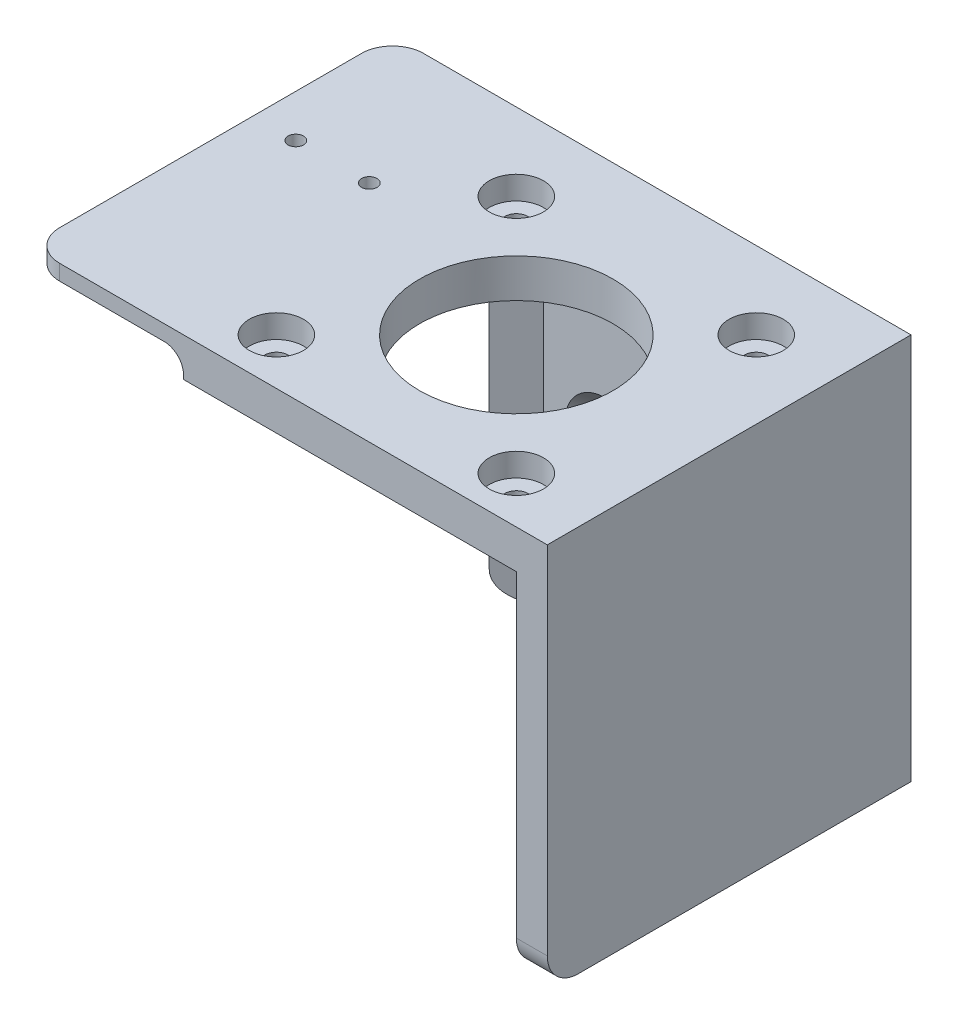
ISO-10303-21;
HEADER;
FILE_DESCRIPTION(('STEP AP214'),'2;1');
FILE_NAME('part.step','',(''),(''),'','','');
FILE_SCHEMA(('AUTOMOTIVE_DESIGN { 1 0 10303 214 1 1 1 1 }'));
ENDSEC;
DATA;
#1=APPLICATION_CONTEXT('core data for automotive mechanical design processes');
#2=APPLICATION_PROTOCOL_DEFINITION('international standard','automotive_design',2000,#1);
#3=PRODUCT_CONTEXT('',#1,'mechanical');
#4=PRODUCT('Part','Part','',(#3));
#5=PRODUCT_RELATED_PRODUCT_CATEGORY('part','',(#4));
#6=PRODUCT_DEFINITION_FORMATION('','',#4);
#7=PRODUCT_DEFINITION_CONTEXT('part definition',#1,'design');
#8=PRODUCT_DEFINITION('design','',#6,#7);
#9=PRODUCT_DEFINITION_SHAPE('','',#8);
#10=(LENGTH_UNIT() NAMED_UNIT(*) SI_UNIT(.MILLI.,.METRE.));
#11=(NAMED_UNIT(*) PLANE_ANGLE_UNIT() SI_UNIT($,.RADIAN.));
#12=(NAMED_UNIT(*) SI_UNIT($,.STERADIAN.) SOLID_ANGLE_UNIT());
#13=UNCERTAINTY_MEASURE_WITH_UNIT(LENGTH_MEASURE(1.E-05),#10,'distance_accuracy_value','');
#14=(GEOMETRIC_REPRESENTATION_CONTEXT(3) GLOBAL_UNCERTAINTY_ASSIGNED_CONTEXT((#13)) GLOBAL_UNIT_ASSIGNED_CONTEXT((#10,
#11,#12)) REPRESENTATION_CONTEXT('',''));
#15=CARTESIAN_POINT('',(0.,0.,0.));
#16=DIRECTION('',(0.,0.,1.));
#17=DIRECTION('',(1.,0.,0.));
#18=AXIS2_PLACEMENT_3D('',#15,#16,#17);
#19=CARTESIAN_POINT('',(0.,50.,0.));
#20=DIRECTION('',(0.,-1.,0.));
#21=DIRECTION('',(0.,0.,-1.));
#22=AXIS2_PLACEMENT_3D('',#19,#20,#21);
#23=PLANE('',#22);
#24=DIRECTION('',(0.,0.,1.));
#25=VECTOR('',#24,1.);
#26=CARTESIAN_POINT('',(-20.,50.,0.));
#27=LINE('',#26,#25);
#28=CARTESIAN_POINT('',(-20.,50.,4.));
#29=VERTEX_POINT('',#28);
#30=CARTESIAN_POINT('',(-20.,50.,43.));
#31=VERTEX_POINT('',#30);
#32=EDGE_CURVE('E203',#29,#31,#27,.T.);
#33=ORIENTED_EDGE('',*,*,#32,.T.);
#34=CARTESIAN_POINT('',(-16.,50.,43.));
#35=DIRECTION('',(0.,-1.,0.));
#36=DIRECTION('',(0.,0.,-1.));
#37=AXIS2_PLACEMENT_3D('',#34,#35,#36);
#38=CIRCLE('',#37,4.);
#39=CARTESIAN_POINT('',(-16.,50.,47.));
#40=VERTEX_POINT('',#39);
#41=EDGE_CURVE('E412',#31,#40,#38,.F.);
#42=ORIENTED_EDGE('',*,*,#41,.T.);
#43=DIRECTION('',(1.,0.,0.));
#44=VECTOR('',#43,1.);
#45=CARTESIAN_POINT('',(47.,50.,47.));
#46=LINE('',#45,#44);
#47=CARTESIAN_POINT('',(47.,50.,47.));
#48=VERTEX_POINT('',#47);
#49=EDGE_CURVE('E208',#40,#48,#46,.T.);
#50=ORIENTED_EDGE('',*,*,#49,.T.);
#51=DIRECTION('',(0.,0.,-1.));
#52=VECTOR('',#51,1.);
#53=CARTESIAN_POINT('',(47.,50.,0.));
#54=LINE('',#53,#52);
#55=CARTESIAN_POINT('',(47.,50.,0.));
#56=VERTEX_POINT('',#55);
#57=EDGE_CURVE('E183',#48,#56,#54,.T.);
#58=ORIENTED_EDGE('',*,*,#57,.T.);
#59=DIRECTION('',(-1.,0.,0.));
#60=VECTOR('',#59,1.);
#61=CARTESIAN_POINT('',(47.,50.,0.));
#62=LINE('',#61,#60);
#63=CARTESIAN_POINT('',(-16.,50.,0.));
#64=VERTEX_POINT('',#63);
#65=EDGE_CURVE('E194',#56,#64,#62,.T.);
#66=ORIENTED_EDGE('',*,*,#65,.T.);
#67=CARTESIAN_POINT('',(-16.,50.,4.));
#68=DIRECTION('',(0.,-1.,0.));
#69=DIRECTION('',(0.,0.,-1.));
#70=AXIS2_PLACEMENT_3D('',#67,#68,#69);
#71=CIRCLE('',#70,4.);
#72=EDGE_CURVE('E409',#64,#29,#71,.F.);
#73=ORIENTED_EDGE('',*,*,#72,.T.);
#74=EDGE_LOOP('',(#33,#42,#50,#58,#66,#73));
#75=FACE_BOUND('',#74,.T.);
#76=CARTESIAN_POINT('',(6.,50.,10.));
#77=DIRECTION('',(0.,1.,0.));
#78=DIRECTION('',(0.,0.,1.));
#79=AXIS2_PLACEMENT_3D('',#76,#77,#78);
#80=CIRCLE('',#79,3.5);
#81=CARTESIAN_POINT('',(6.,50.,13.5));
#82=VERTEX_POINT('',#81);
#83=EDGE_CURVE('E211',#82,#82,#80,.T.);
#84=ORIENTED_EDGE('',*,*,#83,.F.);
#85=EDGE_LOOP('',(#84));
#86=FACE_BOUND('',#85,.T.);
#87=CARTESIAN_POINT('',(6.,50.,41.));
#88=DIRECTION('',(0.,1.,0.));
#89=DIRECTION('',(0.,0.,1.));
#90=AXIS2_PLACEMENT_3D('',#87,#88,#89);
#91=CIRCLE('',#90,3.5);
#92=CARTESIAN_POINT('',(6.,50.,44.5));
#93=VERTEX_POINT('',#92);
#94=EDGE_CURVE('E564',#93,#93,#91,.T.);
#95=ORIENTED_EDGE('',*,*,#94,.F.);
#96=EDGE_LOOP('',(#95));
#97=FACE_BOUND('',#96,.T.);
#98=CARTESIAN_POINT('',(37.,50.,10.));
#99=DIRECTION('',(0.,1.,0.));
#100=DIRECTION('',(0.,0.,1.));
#101=AXIS2_PLACEMENT_3D('',#98,#99,#100);
#102=CIRCLE('',#101,3.5);
#103=CARTESIAN_POINT('',(37.,50.,13.5));
#104=VERTEX_POINT('',#103);
#105=EDGE_CURVE('E556',#104,#104,#102,.T.);
#106=ORIENTED_EDGE('',*,*,#105,.F.);
#107=EDGE_LOOP('',(#106));
#108=FACE_BOUND('',#107,.T.);
#109=CARTESIAN_POINT('',(37.,50.,41.));
#110=DIRECTION('',(0.,1.,0.));
#111=DIRECTION('',(0.,0.,1.));
#112=AXIS2_PLACEMENT_3D('',#109,#110,#111);
#113=CIRCLE('',#112,3.5);
#114=CARTESIAN_POINT('',(37.,50.,44.5));
#115=VERTEX_POINT('',#114);
#116=EDGE_CURVE('E548',#115,#115,#113,.T.);
#117=ORIENTED_EDGE('',*,*,#116,.F.);
#118=EDGE_LOOP('',(#117));
#119=FACE_BOUND('',#118,.T.);
#120=CARTESIAN_POINT('',(21.5,50.,25.5));
#121=DIRECTION('',(0.,1.,0.));
#122=DIRECTION('',(0.,0.,1.));
#123=AXIS2_PLACEMENT_3D('',#120,#121,#122);
#124=CIRCLE('',#123,12.5);
#125=CARTESIAN_POINT('',(21.5,50.,38.));
#126=VERTEX_POINT('',#125);
#127=EDGE_CURVE('E543',#126,#126,#124,.T.);
#128=ORIENTED_EDGE('',*,*,#127,.F.);
#129=EDGE_LOOP('',(#128));
#130=FACE_BOUND('',#129,.T.);
#131=CARTESIAN_POINT('',(-14.5,50.,18.));
#132=DIRECTION('',(0.,1.,0.));
#133=DIRECTION('',(0.,0.,1.));
#134=AXIS2_PLACEMENT_3D('',#131,#132,#133);
#135=CIRCLE('',#134,0.999999999999999);
#136=CARTESIAN_POINT('',(-14.5,50.,19.));
#137=VERTEX_POINT('',#136);
#138=EDGE_CURVE('E539',#137,#137,#135,.T.);
#139=ORIENTED_EDGE('',*,*,#138,.F.);
#140=EDGE_LOOP('',(#139));
#141=FACE_BOUND('',#140,.T.);
#142=CARTESIAN_POINT('',(-5.,50.,18.));
#143=DIRECTION('',(0.,1.,0.));
#144=DIRECTION('',(0.,0.,1.));
#145=AXIS2_PLACEMENT_3D('',#142,#143,#144);
#146=CIRCLE('',#145,1.);
#147=CARTESIAN_POINT('',(-5.,50.,19.));
#148=VERTEX_POINT('',#147);
#149=EDGE_CURVE('E535',#148,#148,#146,.T.);
#150=ORIENTED_EDGE('',*,*,#149,.F.);
#151=EDGE_LOOP('',(#150));
#152=FACE_BOUND('',#151,.T.);
#153=ADVANCED_FACE('F64',(#75,#86,#97,#108,#119,#130,#141,#152),#23,.F.);
#154=CARTESIAN_POINT('',(0.,47.,4.));
#155=DIRECTION('',(0.,-1.,0.));
#156=DIRECTION('',(0.,0.,-1.));
#157=AXIS2_PLACEMENT_3D('',#154,#155,#156);
#158=PLANE('',#157);
#159=CARTESIAN_POINT('',(37.,47.,41.));
#160=DIRECTION('',(0.,1.,0.));
#161=DIRECTION('',(0.,0.,1.));
#162=AXIS2_PLACEMENT_3D('',#159,#160,#161);
#163=CIRCLE('',#162,1.5);
#164=CARTESIAN_POINT('',(37.,47.,42.5));
#165=VERTEX_POINT('',#164);
#166=EDGE_CURVE('E312',#165,#165,#163,.T.);
#167=ORIENTED_EDGE('',*,*,#166,.F.);
#168=EDGE_LOOP('',(#167));
#169=FACE_BOUND('',#168,.T.);
#170=CARTESIAN_POINT('',(37.,47.,41.));
#171=DIRECTION('',(0.,1.,0.));
#172=DIRECTION('',(0.,0.,1.));
#173=AXIS2_PLACEMENT_3D('',#170,#171,#172);
#174=CIRCLE('',#173,3.5);
#175=CARTESIAN_POINT('',(37.,47.,44.5));
#176=VERTEX_POINT('',#175);
#177=EDGE_CURVE('E547',#176,#176,#174,.T.);
#178=ORIENTED_EDGE('',*,*,#177,.T.);
#179=EDGE_LOOP('',(#178));
#180=FACE_BOUND('',#179,.T.);
#181=ADVANCED_FACE('F483',(#169,#180),#158,.F.);
#182=CARTESIAN_POINT('',(6.,47.,41.));
#183=DIRECTION('',(0.,1.,0.));
#184=DIRECTION('',(0.,0.,1.));
#185=AXIS2_PLACEMENT_3D('',#182,#183,#184);
#186=CIRCLE('',#185,1.5);
#187=CARTESIAN_POINT('',(6.,47.,42.5));
#188=VERTEX_POINT('',#187);
#189=EDGE_CURVE('E320',#188,#188,#186,.T.);
#190=ORIENTED_EDGE('',*,*,#189,.F.);
#191=EDGE_LOOP('',(#190));
#192=FACE_BOUND('',#191,.T.);
#193=CARTESIAN_POINT('',(6.,47.,41.));
#194=DIRECTION('',(0.,1.,0.));
#195=DIRECTION('',(0.,0.,1.));
#196=AXIS2_PLACEMENT_3D('',#193,#194,#195);
#197=CIRCLE('',#196,3.5);
#198=CARTESIAN_POINT('',(6.,47.,44.5));
#199=VERTEX_POINT('',#198);
#200=EDGE_CURVE('E560',#199,#199,#197,.T.);
#201=ORIENTED_EDGE('',*,*,#200,.T.);
#202=EDGE_LOOP('',(#201));
#203=FACE_BOUND('',#202,.T.);
#204=ADVANCED_FACE('F490',(#192,#203),#158,.F.);
#205=CARTESIAN_POINT('',(6.,47.,10.));
#206=DIRECTION('',(0.,1.,0.));
#207=DIRECTION('',(0.,0.,1.));
#208=AXIS2_PLACEMENT_3D('',#205,#206,#207);
#209=CIRCLE('',#208,1.5);
#210=CARTESIAN_POINT('',(6.,47.,11.5));
#211=VERTEX_POINT('',#210);
#212=EDGE_CURVE('E296',#211,#211,#209,.T.);
#213=ORIENTED_EDGE('',*,*,#212,.F.);
#214=EDGE_LOOP('',(#213));
#215=FACE_BOUND('',#214,.T.);
#216=CARTESIAN_POINT('',(6.,47.,10.));
#217=DIRECTION('',(0.,1.,0.));
#218=DIRECTION('',(0.,0.,1.));
#219=AXIS2_PLACEMENT_3D('',#216,#217,#218);
#220=CIRCLE('',#219,3.5);
#221=CARTESIAN_POINT('',(6.,47.,13.5));
#222=VERTEX_POINT('',#221);
#223=EDGE_CURVE('E215',#222,#222,#220,.T.);
#224=ORIENTED_EDGE('',*,*,#223,.T.);
#225=EDGE_LOOP('',(#224));
#226=FACE_BOUND('',#225,.T.);
#227=ADVANCED_FACE('F766',(#215,#226),#158,.F.);
#228=CARTESIAN_POINT('',(37.,47.,10.));
#229=DIRECTION('',(0.,1.,0.));
#230=DIRECTION('',(0.,0.,1.));
#231=AXIS2_PLACEMENT_3D('',#228,#229,#230);
#232=CIRCLE('',#231,1.5);
#233=CARTESIAN_POINT('',(37.,47.,11.5));
#234=VERTEX_POINT('',#233);
#235=EDGE_CURVE('E304',#234,#234,#232,.T.);
#236=ORIENTED_EDGE('',*,*,#235,.F.);
#237=EDGE_LOOP('',(#236));
#238=FACE_BOUND('',#237,.T.);
#239=CARTESIAN_POINT('',(37.,47.,10.));
#240=DIRECTION('',(0.,1.,0.));
#241=DIRECTION('',(0.,0.,1.));
#242=AXIS2_PLACEMENT_3D('',#239,#240,#241);
#243=CIRCLE('',#242,3.5);
#244=CARTESIAN_POINT('',(37.,47.,13.5));
#245=VERTEX_POINT('',#244);
#246=EDGE_CURVE('E552',#245,#245,#243,.T.);
#247=ORIENTED_EDGE('',*,*,#246,.T.);
#248=EDGE_LOOP('',(#247));
#249=FACE_BOUND('',#248,.T.);
#250=ADVANCED_FACE('F493',(#238,#249),#158,.F.);
#251=CARTESIAN_POINT('',(0.,0.,4.));
#252=DIRECTION('',(0.,0.,-1.));
#253=DIRECTION('',(-1.,0.,0.));
#254=AXIS2_PLACEMENT_3D('',#251,#252,#253);
#255=PLANE('',#254);
#256=CARTESIAN_POINT('',(21.5,12.,4.));
#257=DIRECTION('',(0.,0.,1.));
#258=DIRECTION('',(1.,0.,0.));
#259=AXIS2_PLACEMENT_3D('',#256,#257,#258);
#260=CIRCLE('',#259,5.2);
#261=CARTESIAN_POINT('',(26.7,12.,4.));
#262=VERTEX_POINT('',#261);
#263=EDGE_CURVE('E284',#262,#262,#260,.T.);
#264=ORIENTED_EDGE('',*,*,#263,.F.);
#265=EDGE_LOOP('',(#264));
#266=FACE_BOUND('',#265,.T.);
#267=CARTESIAN_POINT('',(31.5,22.,4.));
#268=DIRECTION('',(0.,0.,1.));
#269=DIRECTION('',(1.,0.,0.));
#270=AXIS2_PLACEMENT_3D('',#267,#268,#269);
#271=CIRCLE('',#270,5.2);
#272=CARTESIAN_POINT('',(36.7,22.,4.));
#273=VERTEX_POINT('',#272);
#274=EDGE_CURVE('E272',#273,#273,#271,.T.);
#275=ORIENTED_EDGE('',*,*,#274,.F.);
#276=EDGE_LOOP('',(#275));
#277=FACE_BOUND('',#276,.T.);
#278=CARTESIAN_POINT('',(21.5,32.,4.));
#279=DIRECTION('',(0.,0.,1.));
#280=DIRECTION('',(1.,0.,0.));
#281=AXIS2_PLACEMENT_3D('',#278,#279,#280);
#282=CIRCLE('',#281,5.2);
#283=CARTESIAN_POINT('',(26.7,32.,4.));
#284=VERTEX_POINT('',#283);
#285=EDGE_CURVE('E260',#284,#284,#282,.T.);
#286=ORIENTED_EDGE('',*,*,#285,.F.);
#287=EDGE_LOOP('',(#286));
#288=FACE_BOUND('',#287,.T.);
#289=CARTESIAN_POINT('',(11.5,22.,4.));
#290=DIRECTION('',(0.,0.,1.));
#291=DIRECTION('',(1.,0.,0.));
#292=AXIS2_PLACEMENT_3D('',#289,#290,#291);
#293=CIRCLE('',#292,5.2);
#294=CARTESIAN_POINT('',(16.7,22.,4.));
#295=VERTEX_POINT('',#294);
#296=EDGE_CURVE('E248',#295,#295,#293,.T.);
#297=ORIENTED_EDGE('',*,*,#296,.F.);
#298=EDGE_LOOP('',(#297));
#299=FACE_BOUND('',#298,.T.);
#300=DIRECTION('',(0.,1.,0.));
#301=VECTOR('',#300,1.);
#302=CARTESIAN_POINT('',(3.5,0.,4.));
#303=LINE('',#302,#301);
#304=CARTESIAN_POINT('',(3.5,0.0313730334031148,4.));
#305=VERTEX_POINT('',#304);
#306=CARTESIAN_POINT('',(3.5,45.,4.));
#307=VERTEX_POINT('',#306);
#308=EDGE_CURVE('E230',#305,#307,#303,.T.);
#309=ORIENTED_EDGE('',*,*,#308,.F.);
#310=CARTESIAN_POINT('',(4.,4.,4.));
#311=DIRECTION('',(0.,0.,-1.));
#312=DIRECTION('',(-1.,0.,0.));
#313=AXIS2_PLACEMENT_3D('',#310,#311,#312);
#314=CIRCLE('',#313,4.);
#315=CARTESIAN_POINT('',(4.,0.,4.));
#316=VERTEX_POINT('',#315);
#317=EDGE_CURVE('E431',#305,#316,#314,.F.);
#318=ORIENTED_EDGE('',*,*,#317,.T.);
#319=DIRECTION('',(1.,0.,0.));
#320=VECTOR('',#319,1.);
#321=CARTESIAN_POINT('',(0.,0.,4.));
#322=LINE('',#321,#320);
#323=CARTESIAN_POINT('',(39.5,0.,4.));
#324=VERTEX_POINT('',#323);
#325=EDGE_CURVE('E190',#316,#324,#322,.T.);
#326=ORIENTED_EDGE('',*,*,#325,.T.);
#327=DIRECTION('',(0.,1.,0.));
#328=VECTOR('',#327,1.);
#329=CARTESIAN_POINT('',(39.5,0.,4.));
#330=LINE('',#329,#328);
#331=CARTESIAN_POINT('',(39.5,45.,4.));
#332=VERTEX_POINT('',#331);
#333=EDGE_CURVE('E238',#324,#332,#330,.T.);
#334=ORIENTED_EDGE('',*,*,#333,.T.);
#335=DIRECTION('',(1.,0.,0.));
#336=VECTOR('',#335,1.);
#337=CARTESIAN_POINT('',(0.,45.,4.));
#338=LINE('',#337,#336);
#339=EDGE_CURVE('E343',#307,#332,#338,.T.);
#340=ORIENTED_EDGE('',*,*,#339,.F.);
#341=EDGE_LOOP('',(#309,#318,#326,#334,#340));
#342=FACE_BOUND('',#341,.T.);
#343=ADVANCED_FACE('F463',(#266,#277,#288,#299,#342),#255,.F.);
#344=CARTESIAN_POINT('',(0.,45.,47.));
#345=DIRECTION('',(0.,1.,0.));
#346=DIRECTION('',(0.,0.,1.));
#347=AXIS2_PLACEMENT_3D('',#344,#345,#346);
#348=PLANE('',#347);
#349=CARTESIAN_POINT('',(6.,45.,10.));
#350=DIRECTION('',(0.,1.,0.));
#351=DIRECTION('',(0.,0.,1.));
#352=AXIS2_PLACEMENT_3D('',#349,#350,#351);
#353=CIRCLE('',#352,1.5);
#354=CARTESIAN_POINT('',(6.,45.,11.5));
#355=VERTEX_POINT('',#354);
#356=EDGE_CURVE('E300',#355,#355,#353,.T.);
#357=ORIENTED_EDGE('',*,*,#356,.T.);
#358=EDGE_LOOP('',(#357));
#359=FACE_BOUND('',#358,.T.);
#360=CARTESIAN_POINT('',(37.,45.,10.));
#361=DIRECTION('',(0.,1.,0.));
#362=DIRECTION('',(0.,0.,1.));
#363=AXIS2_PLACEMENT_3D('',#360,#361,#362);
#364=CIRCLE('',#363,1.5);
#365=CARTESIAN_POINT('',(37.,45.,11.5));
#366=VERTEX_POINT('',#365);
#367=EDGE_CURVE('E308',#366,#366,#364,.T.);
#368=ORIENTED_EDGE('',*,*,#367,.T.);
#369=EDGE_LOOP('',(#368));
#370=FACE_BOUND('',#369,.T.);
#371=CARTESIAN_POINT('',(37.,45.,41.));
#372=DIRECTION('',(0.,1.,0.));
#373=DIRECTION('',(0.,0.,1.));
#374=AXIS2_PLACEMENT_3D('',#371,#372,#373);
#375=CIRCLE('',#374,1.5);
#376=CARTESIAN_POINT('',(37.,45.,42.5));
#377=VERTEX_POINT('',#376);
#378=EDGE_CURVE('E316',#377,#377,#375,.T.);
#379=ORIENTED_EDGE('',*,*,#378,.T.);
#380=EDGE_LOOP('',(#379));
#381=FACE_BOUND('',#380,.T.);
#382=CARTESIAN_POINT('',(6.,45.,41.));
#383=DIRECTION('',(0.,1.,0.));
#384=DIRECTION('',(0.,0.,1.));
#385=AXIS2_PLACEMENT_3D('',#382,#383,#384);
#386=CIRCLE('',#385,1.5);
#387=CARTESIAN_POINT('',(6.,45.,42.5));
#388=VERTEX_POINT('',#387);
#389=EDGE_CURVE('E324',#388,#388,#386,.T.);
#390=ORIENTED_EDGE('',*,*,#389,.T.);
#391=EDGE_LOOP('',(#390));
#392=FACE_BOUND('',#391,.T.);
#393=CARTESIAN_POINT('',(21.5,45.,25.5));
#394=DIRECTION('',(0.,-1.,0.));
#395=DIRECTION('',(0.,0.,-1.));
#396=AXIS2_PLACEMENT_3D('',#393,#394,#395);
#397=CIRCLE('',#396,12.5);
#398=CARTESIAN_POINT('',(21.5,45.,13.));
#399=VERTEX_POINT('',#398);
#400=EDGE_CURVE('E328',#399,#399,#397,.T.);
#401=ORIENTED_EDGE('',*,*,#400,.F.);
#402=EDGE_LOOP('',(#401));
#403=FACE_BOUND('',#402,.T.);
#404=DIRECTION('',(-0.707106781186548,0.,0.707106781186547));
#405=VECTOR('',#404,1.);
#406=CARTESIAN_POINT('',(3.5,45.,4.));
#407=LINE('',#406,#405);
#408=CARTESIAN_POINT('',(0.,45.,7.5));
#409=VERTEX_POINT('',#408);
#410=EDGE_CURVE('E223',#307,#409,#407,.T.);
#411=ORIENTED_EDGE('',*,*,#410,.F.);
#412=ORIENTED_EDGE('',*,*,#339,.T.);
#413=DIRECTION('',(-0.707106781186548,0.,-0.707106781186547));
#414=VECTOR('',#413,1.);
#415=CARTESIAN_POINT('',(39.5,45.,4.));
#416=LINE('',#415,#414);
#417=CARTESIAN_POINT('',(43.,45.,7.5));
#418=VERTEX_POINT('',#417);
#419=EDGE_CURVE('E233',#418,#332,#416,.T.);
#420=ORIENTED_EDGE('',*,*,#419,.F.);
#421=DIRECTION('',(0.,0.,-1.));
#422=VECTOR('',#421,1.);
#423=CARTESIAN_POINT('',(43.,45.,47.));
#424=LINE('',#423,#422);
#425=CARTESIAN_POINT('',(43.,45.,47.));
#426=VERTEX_POINT('',#425);
#427=EDGE_CURVE('E339',#426,#418,#424,.T.);
#428=ORIENTED_EDGE('',*,*,#427,.F.);
#429=DIRECTION('',(1.,0.,0.));
#430=VECTOR('',#429,1.);
#431=CARTESIAN_POINT('',(0.,45.,47.));
#432=LINE('',#431,#430);
#433=CARTESIAN_POINT('',(0.,45.,47.));
#434=VERTEX_POINT('',#433);
#435=EDGE_CURVE('E347',#434,#426,#432,.T.);
#436=ORIENTED_EDGE('',*,*,#435,.F.);
#437=DIRECTION('',(0.,0.,-1.));
#438=VECTOR('',#437,1.);
#439=CARTESIAN_POINT('',(0.,45.,47.));
#440=LINE('',#439,#438);
#441=EDGE_CURVE('E354',#434,#409,#440,.T.);
#442=ORIENTED_EDGE('',*,*,#441,.T.);
#443=EDGE_LOOP('',(#411,#412,#420,#428,#436,#442));
#444=FACE_BOUND('',#443,.T.);
#445=ADVANCED_FACE('F453',(#359,#370,#381,#392,#403,#444),#348,.F.);
#446=CARTESIAN_POINT('',(43.,45.,47.));
#447=DIRECTION('',(1.,0.,0.));
#448=DIRECTION('',(0.,1.,0.));
#449=AXIS2_PLACEMENT_3D('',#446,#447,#448);
#450=PLANE('',#449);
#451=DIRECTION('',(0.,0.,-1.));
#452=VECTOR('',#451,1.);
#453=CARTESIAN_POINT('',(43.,0.,47.));
#454=LINE('',#453,#452);
#455=CARTESIAN_POINT('',(43.,0.,43.));
#456=VERTEX_POINT('',#455);
#457=CARTESIAN_POINT('',(43.,0.,7.5));
#458=VERTEX_POINT('',#457);
#459=EDGE_CURVE('E336',#456,#458,#454,.T.);
#460=ORIENTED_EDGE('',*,*,#459,.F.);
#461=CARTESIAN_POINT('',(43.,4.,43.));
#462=DIRECTION('',(1.,0.,0.));
#463=DIRECTION('',(0.,1.,0.));
#464=AXIS2_PLACEMENT_3D('',#461,#462,#463);
#465=CIRCLE('',#464,4.);
#466=CARTESIAN_POINT('',(43.,4.00000000000002,47.));
#467=VERTEX_POINT('',#466);
#468=EDGE_CURVE('E12',#456,#467,#465,.F.);
#469=ORIENTED_EDGE('',*,*,#468,.T.);
#470=DIRECTION('',(0.,-1.,0.));
#471=VECTOR('',#470,1.);
#472=CARTESIAN_POINT('',(43.,45.,47.));
#473=LINE('',#472,#471);
#474=EDGE_CURVE('E332',#426,#467,#473,.T.);
#475=ORIENTED_EDGE('',*,*,#474,.F.);
#476=ORIENTED_EDGE('',*,*,#427,.T.);
#477=DIRECTION('',(0.,1.,0.));
#478=VECTOR('',#477,1.);
#479=CARTESIAN_POINT('',(43.,0.,7.5));
#480=LINE('',#479,#478);
#481=EDGE_CURVE('E245',#458,#418,#480,.T.);
#482=ORIENTED_EDGE('',*,*,#481,.F.);
#483=EDGE_LOOP('',(#460,#469,#475,#476,#482));
#484=FACE_BOUND('',#483,.T.);
#485=ADVANCED_FACE('F443',(#484),#450,.F.);
#486=CARTESIAN_POINT('',(0.,0.,4.));
#487=DIRECTION('',(1.,0.,0.));
#488=DIRECTION('',(0.,0.,-1.));
#489=AXIS2_PLACEMENT_3D('',#486,#487,#488);
#490=PLANE('',#489);
#491=DIRECTION('',(0.,-1.,0.));
#492=VECTOR('',#491,1.);
#493=CARTESIAN_POINT('',(0.,0.,0.));
#494=LINE('',#493,#492);
#495=CARTESIAN_POINT('',(0.,45.5,0.));
#496=VERTEX_POINT('',#495);
#497=CARTESIAN_POINT('',(0.,4.,0.));
#498=VERTEX_POINT('',#497);
#499=EDGE_CURVE('E360',#496,#498,#494,.T.);
#500=ORIENTED_EDGE('',*,*,#499,.T.);
#501=DIRECTION('',(0.,0.,-1.));
#502=VECTOR('',#501,1.);
#503=CARTESIAN_POINT('',(0.,4.,4.));
#504=LINE('',#503,#502);
#505=CARTESIAN_POINT('',(0.,4.,7.5));
#506=VERTEX_POINT('',#505);
#507=EDGE_CURVE('E88',#498,#506,#504,.F.);
#508=ORIENTED_EDGE('',*,*,#507,.T.);
#509=DIRECTION('',(0.,1.,0.));
#510=VECTOR('',#509,1.);
#511=CARTESIAN_POINT('',(0.,0.,7.5));
#512=LINE('',#511,#510);
#513=EDGE_CURVE('E227',#506,#409,#512,.T.);
#514=ORIENTED_EDGE('',*,*,#513,.T.);
#515=ORIENTED_EDGE('',*,*,#441,.F.);
#516=DIRECTION('',(0.,-1.,0.));
#517=VECTOR('',#516,1.);
#518=CARTESIAN_POINT('',(0.,47.,47.));
#519=LINE('',#518,#517);
#520=CARTESIAN_POINT('',(0.,45.5,47.));
#521=VERTEX_POINT('',#520);
#522=EDGE_CURVE('E344',#521,#434,#519,.T.);
#523=ORIENTED_EDGE('',*,*,#522,.F.);
#524=DIRECTION('',(0.,0.,-1.));
#525=VECTOR('',#524,1.);
#526=CARTESIAN_POINT('',(0.,45.5,0.));
#527=LINE('',#526,#525);
#528=EDGE_CURVE('E369',#521,#496,#527,.T.);
#529=ORIENTED_EDGE('',*,*,#528,.T.);
#530=EDGE_LOOP('',(#500,#508,#514,#515,#523,#529));
#531=FACE_BOUND('',#530,.T.);
#532=ADVANCED_FACE('F455',(#531),#490,.F.);
#533=CARTESIAN_POINT('',(0.,0.,4.));
#534=DIRECTION('',(0.,1.,0.));
#535=DIRECTION('',(0.,0.,1.));
#536=AXIS2_PLACEMENT_3D('',#533,#534,#535);
#537=PLANE('',#536);
#538=ORIENTED_EDGE('',*,*,#325,.F.);
#539=DIRECTION('',(0.,0.,-1.));
#540=VECTOR('',#539,1.);
#541=CARTESIAN_POINT('',(4.,0.,4.));
#542=LINE('',#541,#540);
#543=CARTESIAN_POINT('',(4.,0.,0.));
#544=VERTEX_POINT('',#543);
#545=EDGE_CURVE('E423',#316,#544,#542,.T.);
#546=ORIENTED_EDGE('',*,*,#545,.T.);
#547=DIRECTION('',(1.,0.,0.));
#548=VECTOR('',#547,1.);
#549=CARTESIAN_POINT('',(0.,0.,0.));
#550=LINE('',#549,#548);
#551=CARTESIAN_POINT('',(47.,0.,0.));
#552=VERTEX_POINT('',#551);
#553=EDGE_CURVE('E191',#544,#552,#550,.T.);
#554=ORIENTED_EDGE('',*,*,#553,.T.);
#555=DIRECTION('',(0.,0.,-1.));
#556=VECTOR('',#555,1.);
#557=CARTESIAN_POINT('',(47.,0.,4.));
#558=LINE('',#557,#556);
#559=CARTESIAN_POINT('',(47.,0.,43.));
#560=VERTEX_POINT('',#559);
#561=EDGE_CURVE('E185',#560,#552,#558,.T.);
#562=ORIENTED_EDGE('',*,*,#561,.F.);
#563=DIRECTION('',(1.,0.,0.));
#564=VECTOR('',#563,1.);
#565=CARTESIAN_POINT('',(43.,0.,43.));
#566=LINE('',#565,#564);
#567=EDGE_CURVE('E420',#560,#456,#566,.F.);
#568=ORIENTED_EDGE('',*,*,#567,.T.);
#569=ORIENTED_EDGE('',*,*,#459,.T.);
#570=DIRECTION('',(-0.707106781186548,0.,-0.707106781186547));
#571=VECTOR('',#570,1.);
#572=CARTESIAN_POINT('',(39.5,0.,4.));
#573=LINE('',#572,#571);
#574=EDGE_CURVE('E234',#458,#324,#573,.T.);
#575=ORIENTED_EDGE('',*,*,#574,.T.);
#576=EDGE_LOOP('',(#538,#546,#554,#562,#568,#569,#575));
#577=FACE_BOUND('',#576,.T.);
#578=ADVANCED_FACE('F439',(#577),#537,.F.);
#579=CARTESIAN_POINT('',(47.,0.,4.));
#580=DIRECTION('',(-1.,0.,0.));
#581=DIRECTION('',(0.,0.,1.));
#582=AXIS2_PLACEMENT_3D('',#579,#580,#581);
#583=PLANE('',#582);
#584=DIRECTION('',(0.,1.,0.));
#585=VECTOR('',#584,1.);
#586=CARTESIAN_POINT('',(47.,47.,47.));
#587=LINE('',#586,#585);
#588=CARTESIAN_POINT('',(47.,4.,47.));
#589=VERTEX_POINT('',#588);
#590=EDGE_CURVE('E351',#589,#48,#587,.T.);
#591=ORIENTED_EDGE('',*,*,#590,.F.);
#592=CARTESIAN_POINT('',(47.,4.,43.));
#593=DIRECTION('',(-1.,0.,0.));
#594=DIRECTION('',(0.,0.,1.));
#595=AXIS2_PLACEMENT_3D('',#592,#593,#594);
#596=CIRCLE('',#595,4.);
#597=EDGE_CURVE('E73',#589,#560,#596,.F.);
#598=ORIENTED_EDGE('',*,*,#597,.T.);
#599=ORIENTED_EDGE('',*,*,#561,.T.);
#600=DIRECTION('',(0.,1.,0.));
#601=VECTOR('',#600,1.);
#602=CARTESIAN_POINT('',(47.,0.,0.));
#603=LINE('',#602,#601);
#604=EDGE_CURVE('E178',#552,#56,#603,.T.);
#605=ORIENTED_EDGE('',*,*,#604,.T.);
#606=ORIENTED_EDGE('',*,*,#57,.F.);
#607=EDGE_LOOP('',(#591,#598,#599,#605,#606));
#608=FACE_BOUND('',#607,.T.);
#609=ADVANCED_FACE('F181',(#608),#583,.F.);
#610=CARTESIAN_POINT('',(0.,0.,0.));
#611=DIRECTION('',(0.,0.,-1.));
#612=DIRECTION('',(-1.,0.,0.));
#613=AXIS2_PLACEMENT_3D('',#610,#611,#612);
#614=PLANE('',#613);
#615=DIRECTION('',(-1.,0.,0.));
#616=VECTOR('',#615,1.);
#617=CARTESIAN_POINT('',(0.,48.,0.));
#618=LINE('',#617,#616);
#619=CARTESIAN_POINT('',(-2.5,48.,0.));
#620=VERTEX_POINT('',#619);
#621=CARTESIAN_POINT('',(-16.,48.,0.));
#622=VERTEX_POINT('',#621);
#623=EDGE_CURVE('E375',#620,#622,#618,.T.);
#624=ORIENTED_EDGE('',*,*,#623,.T.);
#625=DIRECTION('',(0.,-1.,0.));
#626=VECTOR('',#625,1.);
#627=CARTESIAN_POINT('',(-16.,50.,0.));
#628=LINE('',#627,#626);
#629=EDGE_CURVE('E199',#622,#64,#628,.F.);
#630=ORIENTED_EDGE('',*,*,#629,.T.);
#631=ORIENTED_EDGE('',*,*,#65,.F.);
#632=ORIENTED_EDGE('',*,*,#604,.F.);
#633=ORIENTED_EDGE('',*,*,#553,.F.);
#634=CARTESIAN_POINT('',(4.,4.,0.));
#635=DIRECTION('',(0.,0.,-1.));
#636=DIRECTION('',(-1.,0.,0.));
#637=AXIS2_PLACEMENT_3D('',#634,#635,#636);
#638=CIRCLE('',#637,4.);
#639=EDGE_CURVE('E415',#544,#498,#638,.T.);
#640=ORIENTED_EDGE('',*,*,#639,.T.);
#641=ORIENTED_EDGE('',*,*,#499,.F.);
#642=CARTESIAN_POINT('',(-2.5,45.5,0.));
#643=DIRECTION('',(0.,0.,-1.));
#644=DIRECTION('',(-1.,0.,0.));
#645=AXIS2_PLACEMENT_3D('',#642,#643,#644);
#646=CIRCLE('',#645,2.5);
#647=EDGE_CURVE('E382',#496,#620,#646,.F.);
#648=ORIENTED_EDGE('',*,*,#647,.T.);
#649=EDGE_LOOP('',(#624,#630,#631,#632,#633,#640,#641,#648));
#650=FACE_BOUND('',#649,.T.);
#651=CARTESIAN_POINT('',(11.5,22.,0.));
#652=DIRECTION('',(0.,0.,-1.));
#653=DIRECTION('',(-1.,0.,0.));
#654=AXIS2_PLACEMENT_3D('',#651,#652,#653);
#655=CIRCLE('',#654,2.75);
#656=CARTESIAN_POINT('',(8.75,22.,0.));
#657=VERTEX_POINT('',#656);
#658=EDGE_CURVE('E256',#657,#657,#655,.T.);
#659=ORIENTED_EDGE('',*,*,#658,.F.);
#660=EDGE_LOOP('',(#659));
#661=FACE_BOUND('',#660,.T.);
#662=CARTESIAN_POINT('',(21.5,32.,0.));
#663=DIRECTION('',(0.,0.,-1.));
#664=DIRECTION('',(-1.,0.,0.));
#665=AXIS2_PLACEMENT_3D('',#662,#663,#664);
#666=CIRCLE('',#665,2.75);
#667=CARTESIAN_POINT('',(18.75,32.,0.));
#668=VERTEX_POINT('',#667);
#669=EDGE_CURVE('E268',#668,#668,#666,.T.);
#670=ORIENTED_EDGE('',*,*,#669,.F.);
#671=EDGE_LOOP('',(#670));
#672=FACE_BOUND('',#671,.T.);
#673=CARTESIAN_POINT('',(31.5,22.,0.));
#674=DIRECTION('',(0.,0.,-1.));
#675=DIRECTION('',(-1.,0.,0.));
#676=AXIS2_PLACEMENT_3D('',#673,#674,#675);
#677=CIRCLE('',#676,2.75);
#678=CARTESIAN_POINT('',(28.75,22.,0.));
#679=VERTEX_POINT('',#678);
#680=EDGE_CURVE('E280',#679,#679,#677,.T.);
#681=ORIENTED_EDGE('',*,*,#680,.F.);
#682=EDGE_LOOP('',(#681));
#683=FACE_BOUND('',#682,.T.);
#684=CARTESIAN_POINT('',(21.5,12.,0.));
#685=DIRECTION('',(0.,0.,-1.));
#686=DIRECTION('',(-1.,0.,0.));
#687=AXIS2_PLACEMENT_3D('',#684,#685,#686);
#688=CIRCLE('',#687,2.75);
#689=CARTESIAN_POINT('',(18.75,12.,0.));
#690=VERTEX_POINT('',#689);
#691=EDGE_CURVE('E292',#690,#690,#688,.T.);
#692=ORIENTED_EDGE('',*,*,#691,.F.);
#693=EDGE_LOOP('',(#692));
#694=FACE_BOUND('',#693,.T.);
#695=ADVANCED_FACE('F196',(#650,#661,#672,#683,#694),#614,.T.);
#696=CARTESIAN_POINT('',(0.,0.,47.));
#697=DIRECTION('',(0.,0.,1.));
#698=DIRECTION('',(1.,0.,0.));
#699=AXIS2_PLACEMENT_3D('',#696,#697,#698);
#700=PLANE('',#699);
#701=ORIENTED_EDGE('',*,*,#49,.F.);
#702=DIRECTION('',(0.,-1.,0.));
#703=VECTOR('',#702,1.);
#704=CARTESIAN_POINT('',(-16.,48.,47.));
#705=LINE('',#704,#703);
#706=CARTESIAN_POINT('',(-16.,48.,47.));
#707=VERTEX_POINT('',#706);
#708=EDGE_CURVE('E392',#40,#707,#705,.T.);
#709=ORIENTED_EDGE('',*,*,#708,.T.);
#710=DIRECTION('',(-1.,0.,0.));
#711=VECTOR('',#710,1.);
#712=CARTESIAN_POINT('',(0.,48.,47.));
#713=LINE('',#712,#711);
#714=CARTESIAN_POINT('',(-2.5,48.,47.));
#715=VERTEX_POINT('',#714);
#716=EDGE_CURVE('E514',#715,#707,#713,.T.);
#717=ORIENTED_EDGE('',*,*,#716,.F.);
#718=CARTESIAN_POINT('',(-2.5,45.5,47.));
#719=DIRECTION('',(0.,0.,1.));
#720=DIRECTION('',(1.,0.,0.));
#721=AXIS2_PLACEMENT_3D('',#718,#719,#720);
#722=CIRCLE('',#721,2.5);
#723=EDGE_CURVE('E385',#715,#521,#722,.F.);
#724=ORIENTED_EDGE('',*,*,#723,.T.);
#725=ORIENTED_EDGE('',*,*,#522,.T.);
#726=ORIENTED_EDGE('',*,*,#435,.T.);
#727=ORIENTED_EDGE('',*,*,#474,.T.);
#728=DIRECTION('',(1.,0.,0.));
#729=VECTOR('',#728,1.);
#730=CARTESIAN_POINT('',(47.,4.,47.));
#731=LINE('',#730,#729);
#732=EDGE_CURVE('E388',#467,#589,#731,.T.);
#733=ORIENTED_EDGE('',*,*,#732,.T.);
#734=ORIENTED_EDGE('',*,*,#590,.T.);
#735=EDGE_LOOP('',(#701,#709,#717,#724,#725,#726,#727,#733,#734));
#736=FACE_BOUND('',#735,.T.);
#737=ADVANCED_FACE('F447',(#736),#700,.T.);
#738=CARTESIAN_POINT('',(21.5,47.,25.5));
#739=DIRECTION('',(0.,-1.,0.));
#740=DIRECTION('',(0.,0.,-1.));
#741=AXIS2_PLACEMENT_3D('',#738,#739,#740);
#742=CYLINDRICAL_SURFACE('',#741,12.5);
#743=ORIENTED_EDGE('',*,*,#400,.T.);
#744=EDGE_LOOP('',(#743));
#745=FACE_BOUND('',#744,.T.);
#746=ORIENTED_EDGE('',*,*,#127,.T.);
#747=EDGE_LOOP('',(#746));
#748=FACE_BOUND('',#747,.T.);
#749=ADVANCED_FACE('F701',(#745,#748),#742,.F.);
#750=CARTESIAN_POINT('',(6.,47.,41.));
#751=DIRECTION('',(0.,1.,0.));
#752=DIRECTION('',(0.,0.,1.));
#753=AXIS2_PLACEMENT_3D('',#750,#751,#752);
#754=CYLINDRICAL_SURFACE('',#753,1.5);
#755=ORIENTED_EDGE('',*,*,#389,.F.);
#756=EDGE_LOOP('',(#755));
#757=FACE_BOUND('',#756,.T.);
#758=ORIENTED_EDGE('',*,*,#189,.T.);
#759=EDGE_LOOP('',(#758));
#760=FACE_BOUND('',#759,.T.);
#761=ADVANCED_FACE('F707',(#757,#760),#754,.F.);
#762=CARTESIAN_POINT('',(37.,47.,41.));
#763=DIRECTION('',(0.,1.,0.));
#764=DIRECTION('',(0.,0.,1.));
#765=AXIS2_PLACEMENT_3D('',#762,#763,#764);
#766=CYLINDRICAL_SURFACE('',#765,1.5);
#767=ORIENTED_EDGE('',*,*,#378,.F.);
#768=EDGE_LOOP('',(#767));
#769=FACE_BOUND('',#768,.T.);
#770=ORIENTED_EDGE('',*,*,#166,.T.);
#771=EDGE_LOOP('',(#770));
#772=FACE_BOUND('',#771,.T.);
#773=ADVANCED_FACE('F926',(#769,#772),#766,.F.);
#774=CARTESIAN_POINT('',(37.,47.,10.));
#775=DIRECTION('',(0.,1.,0.));
#776=DIRECTION('',(0.,0.,1.));
#777=AXIS2_PLACEMENT_3D('',#774,#775,#776);
#778=CYLINDRICAL_SURFACE('',#777,1.5);
#779=ORIENTED_EDGE('',*,*,#367,.F.);
#780=EDGE_LOOP('',(#779));
#781=FACE_BOUND('',#780,.T.);
#782=ORIENTED_EDGE('',*,*,#235,.T.);
#783=EDGE_LOOP('',(#782));
#784=FACE_BOUND('',#783,.T.);
#785=ADVANCED_FACE('F915',(#781,#784),#778,.F.);
#786=CARTESIAN_POINT('',(6.,47.,10.));
#787=DIRECTION('',(0.,1.,0.));
#788=DIRECTION('',(0.,0.,1.));
#789=AXIS2_PLACEMENT_3D('',#786,#787,#788);
#790=CYLINDRICAL_SURFACE('',#789,1.5);
#791=ORIENTED_EDGE('',*,*,#356,.F.);
#792=EDGE_LOOP('',(#791));
#793=FACE_BOUND('',#792,.T.);
#794=ORIENTED_EDGE('',*,*,#212,.T.);
#795=EDGE_LOOP('',(#794));
#796=FACE_BOUND('',#795,.T.);
#797=ADVANCED_FACE('F904',(#793,#796),#790,.F.);
#798=CARTESIAN_POINT('',(21.5,12.,4.));
#799=DIRECTION('',(0.,0.,1.));
#800=DIRECTION('',(1.,0.,0.));
#801=AXIS2_PLACEMENT_3D('',#798,#799,#800);
#802=CYLINDRICAL_SURFACE('',#801,2.75);
#803=CARTESIAN_POINT('',(21.5,12.,1.55));
#804=DIRECTION('',(0.,0.,1.));
#805=DIRECTION('',(1.,0.,0.));
#806=AXIS2_PLACEMENT_3D('',#803,#804,#805);
#807=CIRCLE('',#806,2.75);
#808=CARTESIAN_POINT('',(24.25,12.,1.55));
#809=VERTEX_POINT('',#808);
#810=EDGE_CURVE('E288',#809,#809,#807,.T.);
#811=ORIENTED_EDGE('',*,*,#810,.T.);
#812=EDGE_LOOP('',(#811));
#813=FACE_BOUND('',#812,.T.);
#814=ORIENTED_EDGE('',*,*,#691,.T.);
#815=EDGE_LOOP('',(#814));
#816=FACE_BOUND('',#815,.T.);
#817=ADVANCED_FACE('F894',(#813,#816),#802,.F.);
#818=CARTESIAN_POINT('',(21.5,12.,4.));
#819=DIRECTION('',(0.,0.,1.));
#820=DIRECTION('',(1.,0.,0.));
#821=AXIS2_PLACEMENT_3D('',#818,#819,#820);
#822=CONICAL_SURFACE('',#821,5.2,0.785398163397448);
#823=ORIENTED_EDGE('',*,*,#810,.F.);
#824=EDGE_LOOP('',(#823));
#825=FACE_BOUND('',#824,.T.);
#826=ORIENTED_EDGE('',*,*,#263,.T.);
#827=EDGE_LOOP('',(#826));
#828=FACE_BOUND('',#827,.T.);
#829=ADVANCED_FACE('F884',(#825,#828),#822,.F.);
#830=CARTESIAN_POINT('',(31.5,22.,4.));
#831=DIRECTION('',(0.,0.,1.));
#832=DIRECTION('',(1.,0.,0.));
#833=AXIS2_PLACEMENT_3D('',#830,#831,#832);
#834=CYLINDRICAL_SURFACE('',#833,2.75);
#835=CARTESIAN_POINT('',(31.5,22.,1.55));
#836=DIRECTION('',(0.,0.,1.));
#837=DIRECTION('',(1.,0.,0.));
#838=AXIS2_PLACEMENT_3D('',#835,#836,#837);
#839=CIRCLE('',#838,2.75);
#840=CARTESIAN_POINT('',(34.25,22.,1.55));
#841=VERTEX_POINT('',#840);
#842=EDGE_CURVE('E276',#841,#841,#839,.T.);
#843=ORIENTED_EDGE('',*,*,#842,.T.);
#844=EDGE_LOOP('',(#843));
#845=FACE_BOUND('',#844,.T.);
#846=ORIENTED_EDGE('',*,*,#680,.T.);
#847=EDGE_LOOP('',(#846));
#848=FACE_BOUND('',#847,.T.);
#849=ADVANCED_FACE('F874',(#845,#848),#834,.F.);
#850=CARTESIAN_POINT('',(31.5,22.,4.));
#851=DIRECTION('',(0.,0.,1.));
#852=DIRECTION('',(1.,0.,0.));
#853=AXIS2_PLACEMENT_3D('',#850,#851,#852);
#854=CONICAL_SURFACE('',#853,5.2,0.785398163397448);
#855=ORIENTED_EDGE('',*,*,#842,.F.);
#856=EDGE_LOOP('',(#855));
#857=FACE_BOUND('',#856,.T.);
#858=ORIENTED_EDGE('',*,*,#274,.T.);
#859=EDGE_LOOP('',(#858));
#860=FACE_BOUND('',#859,.T.);
#861=ADVANCED_FACE('F864',(#857,#860),#854,.F.);
#862=CARTESIAN_POINT('',(21.5,32.,4.));
#863=DIRECTION('',(0.,0.,1.));
#864=DIRECTION('',(1.,0.,0.));
#865=AXIS2_PLACEMENT_3D('',#862,#863,#864);
#866=CYLINDRICAL_SURFACE('',#865,2.75);
#867=CARTESIAN_POINT('',(21.5,32.,1.55));
#868=DIRECTION('',(0.,0.,1.));
#869=DIRECTION('',(1.,0.,0.));
#870=AXIS2_PLACEMENT_3D('',#867,#868,#869);
#871=CIRCLE('',#870,2.75);
#872=CARTESIAN_POINT('',(24.25,32.,1.55));
#873=VERTEX_POINT('',#872);
#874=EDGE_CURVE('E264',#873,#873,#871,.T.);
#875=ORIENTED_EDGE('',*,*,#874,.T.);
#876=EDGE_LOOP('',(#875));
#877=FACE_BOUND('',#876,.T.);
#878=ORIENTED_EDGE('',*,*,#669,.T.);
#879=EDGE_LOOP('',(#878));
#880=FACE_BOUND('',#879,.T.);
#881=ADVANCED_FACE('F854',(#877,#880),#866,.F.);
#882=CARTESIAN_POINT('',(21.5,32.,4.));
#883=DIRECTION('',(0.,0.,1.));
#884=DIRECTION('',(1.,0.,0.));
#885=AXIS2_PLACEMENT_3D('',#882,#883,#884);
#886=CONICAL_SURFACE('',#885,5.2,0.785398163397448);
#887=ORIENTED_EDGE('',*,*,#874,.F.);
#888=EDGE_LOOP('',(#887));
#889=FACE_BOUND('',#888,.T.);
#890=ORIENTED_EDGE('',*,*,#285,.T.);
#891=EDGE_LOOP('',(#890));
#892=FACE_BOUND('',#891,.T.);
#893=ADVANCED_FACE('F844',(#889,#892),#886,.F.);
#894=CARTESIAN_POINT('',(11.5,22.,4.));
#895=DIRECTION('',(0.,0.,1.));
#896=DIRECTION('',(1.,0.,0.));
#897=AXIS2_PLACEMENT_3D('',#894,#895,#896);
#898=CYLINDRICAL_SURFACE('',#897,2.75);
#899=CARTESIAN_POINT('',(11.5,22.,1.55));
#900=DIRECTION('',(0.,0.,1.));
#901=DIRECTION('',(1.,0.,0.));
#902=AXIS2_PLACEMENT_3D('',#899,#900,#901);
#903=CIRCLE('',#902,2.75);
#904=CARTESIAN_POINT('',(14.25,22.,1.55));
#905=VERTEX_POINT('',#904);
#906=EDGE_CURVE('E252',#905,#905,#903,.T.);
#907=ORIENTED_EDGE('',*,*,#906,.T.);
#908=EDGE_LOOP('',(#907));
#909=FACE_BOUND('',#908,.T.);
#910=ORIENTED_EDGE('',*,*,#658,.T.);
#911=EDGE_LOOP('',(#910));
#912=FACE_BOUND('',#911,.T.);
#913=ADVANCED_FACE('F479',(#909,#912),#898,.F.);
#914=CARTESIAN_POINT('',(11.5,22.,4.));
#915=DIRECTION('',(0.,0.,1.));
#916=DIRECTION('',(1.,0.,0.));
#917=AXIS2_PLACEMENT_3D('',#914,#915,#916);
#918=CONICAL_SURFACE('',#917,5.2,0.785398163397449);
#919=ORIENTED_EDGE('',*,*,#906,.F.);
#920=EDGE_LOOP('',(#919));
#921=FACE_BOUND('',#920,.T.);
#922=ORIENTED_EDGE('',*,*,#296,.T.);
#923=EDGE_LOOP('',(#922));
#924=FACE_BOUND('',#923,.T.);
#925=ADVANCED_FACE('F470',(#921,#924),#918,.F.);
#926=CARTESIAN_POINT('',(39.5,0.,4.));
#927=DIRECTION('',(0.707106781186547,0.,-0.707106781186548));
#928=DIRECTION('',(-0.707106781186548,0.,-0.707106781186547));
#929=AXIS2_PLACEMENT_3D('',#926,#927,#928);
#930=PLANE('',#929);
#931=ORIENTED_EDGE('',*,*,#419,.T.);
#932=ORIENTED_EDGE('',*,*,#333,.F.);
#933=ORIENTED_EDGE('',*,*,#574,.F.);
#934=ORIENTED_EDGE('',*,*,#481,.T.);
#935=EDGE_LOOP('',(#931,#932,#933,#934));
#936=FACE_BOUND('',#935,.T.);
#937=ADVANCED_FACE('F468',(#936),#930,.F.);
#938=CARTESIAN_POINT('',(3.5,0.,4.));
#939=DIRECTION('',(-0.707106781186547,0.,-0.707106781186548));
#940=DIRECTION('',(-0.707106781186548,0.,0.707106781186547));
#941=AXIS2_PLACEMENT_3D('',#938,#939,#940);
#942=PLANE('',#941);
#943=ORIENTED_EDGE('',*,*,#513,.F.);
#944=CARTESIAN_POINT('',(4.,4.,3.5));
#945=DIRECTION('',(-0.707106781186547,0.,-0.707106781186548));
#946=DIRECTION('',(0.707106781186548,0.,-0.707106781186547));
#947=AXIS2_PLACEMENT_3D('',#944,#945,#946);
#948=ELLIPSE('',#947,5.65685424949238,4.);
#949=EDGE_CURVE('E80',#506,#305,#948,.F.);
#950=ORIENTED_EDGE('',*,*,#949,.T.);
#951=ORIENTED_EDGE('',*,*,#308,.T.);
#952=ORIENTED_EDGE('',*,*,#410,.T.);
#953=EDGE_LOOP('',(#943,#950,#951,#952));
#954=FACE_BOUND('',#953,.T.);
#955=ADVANCED_FACE('F457',(#954),#942,.F.);
#956=CARTESIAN_POINT('',(-20.,50.,0.));
#957=DIRECTION('',(1.,0.,0.));
#958=DIRECTION('',(0.,0.,-1.));
#959=AXIS2_PLACEMENT_3D('',#956,#957,#958);
#960=PLANE('',#959);
#961=DIRECTION('',(0.,0.,-1.));
#962=VECTOR('',#961,1.);
#963=CARTESIAN_POINT('',(-20.,48.,0.));
#964=LINE('',#963,#962);
#965=CARTESIAN_POINT('',(-20.,48.,43.));
#966=VERTEX_POINT('',#965);
#967=CARTESIAN_POINT('',(-20.,48.,4.));
#968=VERTEX_POINT('',#967);
#969=EDGE_CURVE('E508',#966,#968,#964,.T.);
#970=ORIENTED_EDGE('',*,*,#969,.F.);
#971=DIRECTION('',(0.,-1.,0.));
#972=VECTOR('',#971,1.);
#973=CARTESIAN_POINT('',(-20.,50.,43.));
#974=LINE('',#973,#972);
#975=EDGE_CURVE('E406',#966,#31,#974,.F.);
#976=ORIENTED_EDGE('',*,*,#975,.T.);
#977=ORIENTED_EDGE('',*,*,#32,.F.);
#978=DIRECTION('',(0.,-1.,0.));
#979=VECTOR('',#978,1.);
#980=CARTESIAN_POINT('',(-20.,48.,4.));
#981=LINE('',#980,#979);
#982=EDGE_CURVE('E402',#29,#968,#981,.T.);
#983=ORIENTED_EDGE('',*,*,#982,.T.);
#984=EDGE_LOOP('',(#970,#976,#977,#983));
#985=FACE_BOUND('',#984,.T.);
#986=ADVANCED_FACE('F477',(#985),#960,.F.);
#987=CARTESIAN_POINT('',(6.,50.,10.));
#988=DIRECTION('',(0.,-1.,0.));
#989=DIRECTION('',(0.,0.,-1.));
#990=AXIS2_PLACEMENT_3D('',#987,#988,#989);
#991=CYLINDRICAL_SURFACE('',#990,3.5);
#992=ORIENTED_EDGE('',*,*,#83,.T.);
#993=EDGE_LOOP('',(#992));
#994=FACE_BOUND('',#993,.T.);
#995=ORIENTED_EDGE('',*,*,#223,.F.);
#996=EDGE_LOOP('',(#995));
#997=FACE_BOUND('',#996,.T.);
#998=ADVANCED_FACE('F496',(#994,#997),#991,.F.);
#999=CARTESIAN_POINT('',(6.,50.,41.));
#1000=DIRECTION('',(0.,-1.,0.));
#1001=DIRECTION('',(0.,0.,-1.));
#1002=AXIS2_PLACEMENT_3D('',#999,#1000,#1001);
#1003=CYLINDRICAL_SURFACE('',#1002,3.5);
#1004=ORIENTED_EDGE('',*,*,#94,.T.);
#1005=EDGE_LOOP('',(#1004));
#1006=FACE_BOUND('',#1005,.T.);
#1007=ORIENTED_EDGE('',*,*,#200,.F.);
#1008=EDGE_LOOP('',(#1007));
#1009=FACE_BOUND('',#1008,.T.);
#1010=ADVANCED_FACE('F504',(#1006,#1009),#1003,.F.);
#1011=CARTESIAN_POINT('',(37.,50.,10.));
#1012=DIRECTION('',(0.,-1.,0.));
#1013=DIRECTION('',(0.,0.,-1.));
#1014=AXIS2_PLACEMENT_3D('',#1011,#1012,#1013);
#1015=CYLINDRICAL_SURFACE('',#1014,3.5);
#1016=ORIENTED_EDGE('',*,*,#105,.T.);
#1017=EDGE_LOOP('',(#1016));
#1018=FACE_BOUND('',#1017,.T.);
#1019=ORIENTED_EDGE('',*,*,#246,.F.);
#1020=EDGE_LOOP('',(#1019));
#1021=FACE_BOUND('',#1020,.T.);
#1022=ADVANCED_FACE('F574',(#1018,#1021),#1015,.F.);
#1023=CARTESIAN_POINT('',(37.,50.,41.));
#1024=DIRECTION('',(0.,-1.,0.));
#1025=DIRECTION('',(0.,0.,-1.));
#1026=AXIS2_PLACEMENT_3D('',#1023,#1024,#1025);
#1027=CYLINDRICAL_SURFACE('',#1026,3.5);
#1028=ORIENTED_EDGE('',*,*,#116,.T.);
#1029=EDGE_LOOP('',(#1028));
#1030=FACE_BOUND('',#1029,.T.);
#1031=ORIENTED_EDGE('',*,*,#177,.F.);
#1032=EDGE_LOOP('',(#1031));
#1033=FACE_BOUND('',#1032,.T.);
#1034=ADVANCED_FACE('F579',(#1030,#1033),#1027,.F.);
#1035=CARTESIAN_POINT('',(-14.5,50.,18.));
#1036=DIRECTION('',(0.,1.,0.));
#1037=DIRECTION('',(0.,0.,1.));
#1038=AXIS2_PLACEMENT_3D('',#1035,#1036,#1037);
#1039=CYLINDRICAL_SURFACE('',#1038,0.999999999999999);
#1040=CARTESIAN_POINT('',(-14.5,48.,18.));
#1041=DIRECTION('',(0.,1.,0.));
#1042=DIRECTION('',(0.,0.,1.));
#1043=AXIS2_PLACEMENT_3D('',#1040,#1041,#1042);
#1044=CIRCLE('',#1043,0.999999999999999);
#1045=CARTESIAN_POINT('',(-14.5,48.,19.));
#1046=VERTEX_POINT('',#1045);
#1047=EDGE_CURVE('E374',#1046,#1046,#1044,.F.);
#1048=ORIENTED_EDGE('',*,*,#1047,.T.);
#1049=EDGE_LOOP('',(#1048));
#1050=FACE_BOUND('',#1049,.T.);
#1051=ORIENTED_EDGE('',*,*,#138,.T.);
#1052=EDGE_LOOP('',(#1051));
#1053=FACE_BOUND('',#1052,.T.);
#1054=ADVANCED_FACE('F585',(#1050,#1053),#1039,.F.);
#1055=CARTESIAN_POINT('',(-5.,50.,18.));
#1056=DIRECTION('',(0.,1.,0.));
#1057=DIRECTION('',(0.,0.,1.));
#1058=AXIS2_PLACEMENT_3D('',#1055,#1056,#1057);
#1059=CYLINDRICAL_SURFACE('',#1058,1.);
#1060=CARTESIAN_POINT('',(-5.,48.,18.));
#1061=DIRECTION('',(0.,1.,0.));
#1062=DIRECTION('',(0.,0.,1.));
#1063=AXIS2_PLACEMENT_3D('',#1060,#1061,#1062);
#1064=CIRCLE('',#1063,1.);
#1065=CARTESIAN_POINT('',(-5.,48.,19.));
#1066=VERTEX_POINT('',#1065);
#1067=EDGE_CURVE('E370',#1066,#1066,#1064,.F.);
#1068=ORIENTED_EDGE('',*,*,#1067,.T.);
#1069=EDGE_LOOP('',(#1068));
#1070=FACE_BOUND('',#1069,.T.);
#1071=ORIENTED_EDGE('',*,*,#149,.T.);
#1072=EDGE_LOOP('',(#1071));
#1073=FACE_BOUND('',#1072,.T.);
#1074=ADVANCED_FACE('F589',(#1070,#1073),#1059,.F.);
#1075=CARTESIAN_POINT('',(0.,48.,0.));
#1076=DIRECTION('',(0.,1.,0.));
#1077=DIRECTION('',(0.,0.,1.));
#1078=AXIS2_PLACEMENT_3D('',#1075,#1076,#1077);
#1079=PLANE('',#1078);
#1080=ORIENTED_EDGE('',*,*,#1067,.F.);
#1081=EDGE_LOOP('',(#1080));
#1082=FACE_BOUND('',#1081,.T.);
#1083=ORIENTED_EDGE('',*,*,#716,.T.);
#1084=CARTESIAN_POINT('',(-16.,48.,43.));
#1085=DIRECTION('',(0.,1.,0.));
#1086=DIRECTION('',(0.,0.,1.));
#1087=AXIS2_PLACEMENT_3D('',#1084,#1085,#1086);
#1088=CIRCLE('',#1087,4.);
#1089=EDGE_CURVE('E399',#707,#966,#1088,.F.);
#1090=ORIENTED_EDGE('',*,*,#1089,.T.);
#1091=ORIENTED_EDGE('',*,*,#969,.T.);
#1092=CARTESIAN_POINT('',(-16.,48.,4.));
#1093=DIRECTION('',(0.,1.,0.));
#1094=DIRECTION('',(0.,0.,1.));
#1095=AXIS2_PLACEMENT_3D('',#1092,#1093,#1094);
#1096=CIRCLE('',#1095,4.);
#1097=EDGE_CURVE('E396',#968,#622,#1096,.F.);
#1098=ORIENTED_EDGE('',*,*,#1097,.T.);
#1099=ORIENTED_EDGE('',*,*,#623,.F.);
#1100=DIRECTION('',(0.,0.,-1.));
#1101=VECTOR('',#1100,1.);
#1102=CARTESIAN_POINT('',(-2.5,48.,47.));
#1103=LINE('',#1102,#1101);
#1104=EDGE_CURVE('E379',#620,#715,#1103,.F.);
#1105=ORIENTED_EDGE('',*,*,#1104,.T.);
#1106=EDGE_LOOP('',(#1083,#1090,#1091,#1098,#1099,#1105));
#1107=FACE_BOUND('',#1106,.T.);
#1108=ORIENTED_EDGE('',*,*,#1047,.F.);
#1109=EDGE_LOOP('',(#1108));
#1110=FACE_BOUND('',#1109,.T.);
#1111=ADVANCED_FACE('F523',(#1082,#1107,#1110),#1079,.F.);
#1112=CARTESIAN_POINT('',(-2.5,45.5,4.));
#1113=DIRECTION('',(0.,0.,1.));
#1114=DIRECTION('',(1.,0.,0.));
#1115=AXIS2_PLACEMENT_3D('',#1112,#1113,#1114);
#1116=CYLINDRICAL_SURFACE('',#1115,2.5);
#1117=ORIENTED_EDGE('',*,*,#723,.F.);
#1118=ORIENTED_EDGE('',*,*,#1104,.F.);
#1119=ORIENTED_EDGE('',*,*,#647,.F.);
#1120=ORIENTED_EDGE('',*,*,#528,.F.);
#1121=EDGE_LOOP('',(#1117,#1118,#1119,#1120));
#1122=FACE_BOUND('',#1121,.T.);
#1123=ADVANCED_FACE('F594',(#1122),#1116,.F.);
#1124=CARTESIAN_POINT('',(-16.,0.,43.));
#1125=DIRECTION('',(0.,1.,0.));
#1126=DIRECTION('',(0.,0.,1.));
#1127=AXIS2_PLACEMENT_3D('',#1124,#1125,#1126);
#1128=CYLINDRICAL_SURFACE('',#1127,4.);
#1129=ORIENTED_EDGE('',*,*,#41,.F.);
#1130=ORIENTED_EDGE('',*,*,#975,.F.);
#1131=ORIENTED_EDGE('',*,*,#1089,.F.);
#1132=ORIENTED_EDGE('',*,*,#708,.F.);
#1133=EDGE_LOOP('',(#1129,#1130,#1131,#1132));
#1134=FACE_BOUND('',#1133,.T.);
#1135=ADVANCED_FACE('F518',(#1134),#1128,.T.);
#1136=CARTESIAN_POINT('',(-16.,50.,4.));
#1137=DIRECTION('',(0.,1.,0.));
#1138=DIRECTION('',(0.,0.,1.));
#1139=AXIS2_PLACEMENT_3D('',#1136,#1137,#1138);
#1140=CYLINDRICAL_SURFACE('',#1139,4.);
#1141=ORIENTED_EDGE('',*,*,#72,.F.);
#1142=ORIENTED_EDGE('',*,*,#629,.F.);
#1143=ORIENTED_EDGE('',*,*,#1097,.F.);
#1144=ORIENTED_EDGE('',*,*,#982,.F.);
#1145=EDGE_LOOP('',(#1141,#1142,#1143,#1144));
#1146=FACE_BOUND('',#1145,.T.);
#1147=ADVANCED_FACE('F608',(#1146),#1140,.T.);
#1148=CARTESIAN_POINT('',(4.,4.,4.));
#1149=DIRECTION('',(0.,0.,-1.));
#1150=DIRECTION('',(-1.,0.,0.));
#1151=AXIS2_PLACEMENT_3D('',#1148,#1149,#1150);
#1152=CYLINDRICAL_SURFACE('',#1151,4.);
#1153=ORIENTED_EDGE('',*,*,#949,.F.);
#1154=ORIENTED_EDGE('',*,*,#507,.F.);
#1155=ORIENTED_EDGE('',*,*,#639,.F.);
#1156=ORIENTED_EDGE('',*,*,#545,.F.);
#1157=ORIENTED_EDGE('',*,*,#317,.F.);
#1158=EDGE_LOOP('',(#1153,#1154,#1155,#1156,#1157));
#1159=FACE_BOUND('',#1158,.T.);
#1160=ADVANCED_FACE('F460',(#1159),#1152,.T.);
#1161=CARTESIAN_POINT('',(0.,4.,43.));
#1162=DIRECTION('',(-1.,0.,0.));
#1163=DIRECTION('',(0.,0.,1.));
#1164=AXIS2_PLACEMENT_3D('',#1161,#1162,#1163);
#1165=CYLINDRICAL_SURFACE('',#1164,4.);
#1166=ORIENTED_EDGE('',*,*,#468,.F.);
#1167=ORIENTED_EDGE('',*,*,#567,.F.);
#1168=ORIENTED_EDGE('',*,*,#597,.F.);
#1169=ORIENTED_EDGE('',*,*,#732,.F.);
#1170=EDGE_LOOP('',(#1166,#1167,#1168,#1169));
#1171=FACE_BOUND('',#1170,.T.);
#1172=ADVANCED_FACE('F66',(#1171),#1165,.T.);
#1173=CLOSED_SHELL('',(#153,#181,#204,#227,#250,#343,#445,#485,#532,#578,#609,#695,#737,#749,
#761,#773,#785,#797,#817,#829,#849,#861,#881,#893,#913,#925,#937,#955,#986,#998,#1010,#1022,
#1034,#1054,#1074,#1111,#1123,#1135,#1147,#1160,#1172));
#1174=MANIFOLD_SOLID_BREP('B2',#1173);
#1175=ADVANCED_BREP_SHAPE_REPRESENTATION('',(#18,#1174),#14);
#1176=SHAPE_DEFINITION_REPRESENTATION(#9,#1175);
ENDSEC;
END-ISO-10303-21;
